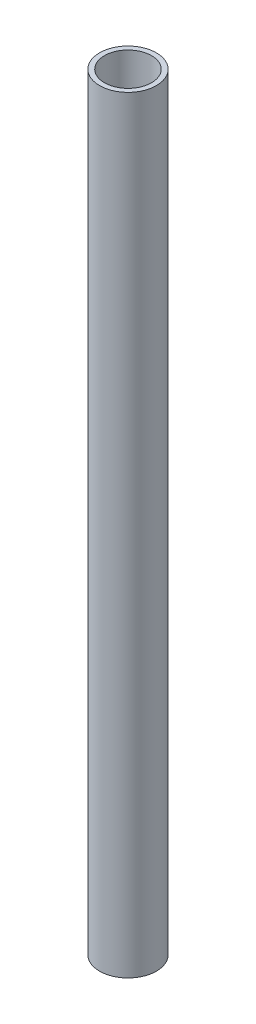
ISO-10303-21;
HEADER;
FILE_DESCRIPTION(('STEP AP214'),'2;1');
FILE_NAME('part.step','',(''),(''),'','','');
FILE_SCHEMA(('AUTOMOTIVE_DESIGN { 1 0 10303 214 1 1 1 1 }'));
ENDSEC;
DATA;
#1=APPLICATION_CONTEXT('core data for automotive mechanical design processes');
#2=APPLICATION_PROTOCOL_DEFINITION('international standard','automotive_design',2000,#1);
#3=PRODUCT_CONTEXT('',#1,'mechanical');
#4=PRODUCT('Part','Part','',(#3));
#5=PRODUCT_RELATED_PRODUCT_CATEGORY('part','',(#4));
#6=PRODUCT_DEFINITION_FORMATION('','',#4);
#7=PRODUCT_DEFINITION_CONTEXT('part definition',#1,'design');
#8=PRODUCT_DEFINITION('design','',#6,#7);
#9=PRODUCT_DEFINITION_SHAPE('','',#8);
#10=(LENGTH_UNIT() NAMED_UNIT(*) SI_UNIT(.MILLI.,.METRE.));
#11=(NAMED_UNIT(*) PLANE_ANGLE_UNIT() SI_UNIT($,.RADIAN.));
#12=(NAMED_UNIT(*) SI_UNIT($,.STERADIAN.) SOLID_ANGLE_UNIT());
#13=UNCERTAINTY_MEASURE_WITH_UNIT(LENGTH_MEASURE(1.E-05),#10,'distance_accuracy_value','');
#14=(GEOMETRIC_REPRESENTATION_CONTEXT(3) GLOBAL_UNCERTAINTY_ASSIGNED_CONTEXT((#13)) GLOBAL_UNIT_ASSIGNED_CONTEXT((#10,
#11,#12)) REPRESENTATION_CONTEXT('',''));
#15=CARTESIAN_POINT('',(0.,0.,0.));
#16=DIRECTION('',(0.,0.,1.));
#17=DIRECTION('',(1.,0.,0.));
#18=AXIS2_PLACEMENT_3D('',#15,#16,#17);
#19=CARTESIAN_POINT('',(0.,1200.,0.));
#20=DIRECTION('',(0.,-1.,0.));
#21=DIRECTION('',(0.,0.,-1.));
#22=AXIS2_PLACEMENT_3D('',#19,#20,#21);
#23=CYLINDRICAL_SURFACE('',#22,36.83);
#24=CARTESIAN_POINT('',(0.,1200.,0.));
#25=DIRECTION('',(0.,1.,0.));
#26=DIRECTION('',(0.,0.,1.));
#27=AXIS2_PLACEMENT_3D('',#24,#25,#26);
#28=CIRCLE('',#27,36.83);
#29=CARTESIAN_POINT('',(0.,1200.,36.83));
#30=VERTEX_POINT('',#29);
#31=EDGE_CURVE('E49',#30,#30,#28,.T.);
#32=ORIENTED_EDGE('',*,*,#31,.T.);
#33=EDGE_LOOP('',(#32));
#34=FACE_BOUND('',#33,.T.);
#35=CARTESIAN_POINT('',(0.,0.,0.));
#36=DIRECTION('',(0.,1.,0.));
#37=DIRECTION('',(0.,0.,1.));
#38=AXIS2_PLACEMENT_3D('',#35,#36,#37);
#39=CIRCLE('',#38,36.83);
#40=CARTESIAN_POINT('',(0.,0.,36.83));
#41=VERTEX_POINT('',#40);
#42=EDGE_CURVE('E55',#41,#41,#39,.T.);
#43=ORIENTED_EDGE('',*,*,#42,.F.);
#44=EDGE_LOOP('',(#43));
#45=FACE_BOUND('',#44,.T.);
#46=ADVANCED_FACE('F42',(#34,#45),#23,.F.);
#47=CARTESIAN_POINT('',(0.,1200.,0.));
#48=DIRECTION('',(0.,-1.,0.));
#49=DIRECTION('',(0.,0.,-1.));
#50=AXIS2_PLACEMENT_3D('',#47,#48,#49);
#51=CYLINDRICAL_SURFACE('',#50,44.45);
#52=CARTESIAN_POINT('',(0.,1200.,0.));
#53=DIRECTION('',(0.,1.,0.));
#54=DIRECTION('',(0.,0.,1.));
#55=AXIS2_PLACEMENT_3D('',#52,#53,#54);
#56=CIRCLE('',#55,44.45);
#57=CARTESIAN_POINT('',(0.,1200.,44.45));
#58=VERTEX_POINT('',#57);
#59=EDGE_CURVE('E11',#58,#58,#56,.T.);
#60=ORIENTED_EDGE('',*,*,#59,.F.);
#61=EDGE_LOOP('',(#60));
#62=FACE_BOUND('',#61,.T.);
#63=CARTESIAN_POINT('',(0.,0.,0.));
#64=DIRECTION('',(0.,1.,0.));
#65=DIRECTION('',(0.,0.,1.));
#66=AXIS2_PLACEMENT_3D('',#63,#64,#65);
#67=CIRCLE('',#66,44.45);
#68=CARTESIAN_POINT('',(0.,0.,44.45));
#69=VERTEX_POINT('',#68);
#70=EDGE_CURVE('E45',#69,#69,#67,.T.);
#71=ORIENTED_EDGE('',*,*,#70,.T.);
#72=EDGE_LOOP('',(#71));
#73=FACE_BOUND('',#72,.T.);
#74=ADVANCED_FACE('F62',(#62,#73),#51,.T.);
#75=CARTESIAN_POINT('',(0.,1200.,0.));
#76=DIRECTION('',(0.,1.,0.));
#77=DIRECTION('',(0.,0.,1.));
#78=AXIS2_PLACEMENT_3D('',#75,#76,#77);
#79=PLANE('',#78);
#80=ORIENTED_EDGE('',*,*,#31,.F.);
#81=EDGE_LOOP('',(#80));
#82=FACE_BOUND('',#81,.T.);
#83=ORIENTED_EDGE('',*,*,#59,.T.);
#84=EDGE_LOOP('',(#83));
#85=FACE_BOUND('',#84,.T.);
#86=ADVANCED_FACE('F66',(#82,#85),#79,.T.);
#87=CARTESIAN_POINT('',(0.,0.,0.));
#88=DIRECTION('',(0.,1.,0.));
#89=DIRECTION('',(0.,0.,1.));
#90=AXIS2_PLACEMENT_3D('',#87,#88,#89);
#91=PLANE('',#90);
#92=ORIENTED_EDGE('',*,*,#42,.T.);
#93=EDGE_LOOP('',(#92));
#94=FACE_BOUND('',#93,.T.);
#95=ORIENTED_EDGE('',*,*,#70,.F.);
#96=EDGE_LOOP('',(#95));
#97=FACE_BOUND('',#96,.T.);
#98=ADVANCED_FACE('F64',(#94,#97),#91,.F.);
#99=CLOSED_SHELL('',(#46,#74,#86,#98));
#100=MANIFOLD_SOLID_BREP('B2',#99);
#101=ADVANCED_BREP_SHAPE_REPRESENTATION('',(#18,#100),#14);
#102=SHAPE_DEFINITION_REPRESENTATION(#9,#101);
ENDSEC;
END-ISO-10303-21;
